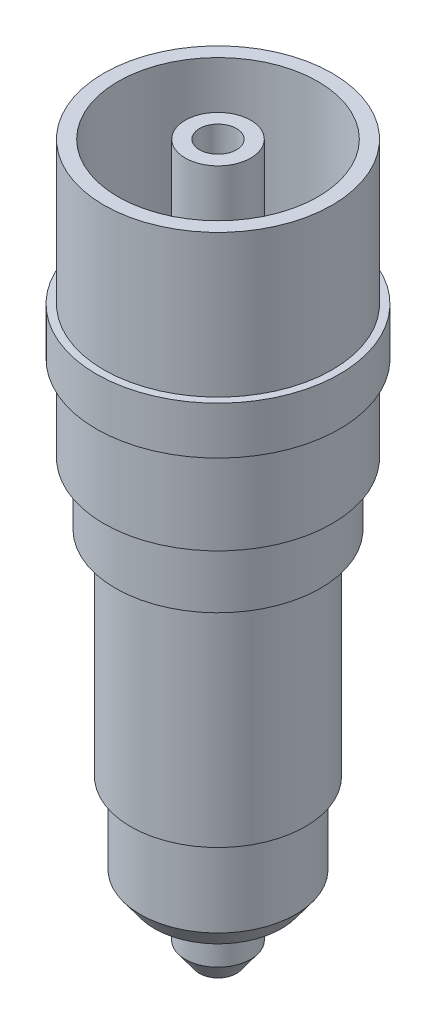
ISO-10303-21;
HEADER;
FILE_DESCRIPTION(('STEP AP214'),'2;1');
FILE_NAME('part.step','',(''),(''),'','','');
FILE_SCHEMA(('AUTOMOTIVE_DESIGN { 1 0 10303 214 1 1 1 1 }'));
ENDSEC;
DATA;
#1=APPLICATION_CONTEXT('core data for automotive mechanical design processes');
#2=APPLICATION_PROTOCOL_DEFINITION('international standard','automotive_design',2000,#1);
#3=PRODUCT_CONTEXT('',#1,'mechanical');
#4=PRODUCT('Part','Part','',(#3));
#5=PRODUCT_RELATED_PRODUCT_CATEGORY('part','',(#4));
#6=PRODUCT_DEFINITION_FORMATION('','',#4);
#7=PRODUCT_DEFINITION_CONTEXT('part definition',#1,'design');
#8=PRODUCT_DEFINITION('design','',#6,#7);
#9=PRODUCT_DEFINITION_SHAPE('','',#8);
#10=(LENGTH_UNIT() NAMED_UNIT(*) SI_UNIT(.MILLI.,.METRE.));
#11=(NAMED_UNIT(*) PLANE_ANGLE_UNIT() SI_UNIT($,.RADIAN.));
#12=(NAMED_UNIT(*) SI_UNIT($,.STERADIAN.) SOLID_ANGLE_UNIT());
#13=UNCERTAINTY_MEASURE_WITH_UNIT(LENGTH_MEASURE(1.E-05),#10,'distance_accuracy_value','');
#14=(GEOMETRIC_REPRESENTATION_CONTEXT(3) GLOBAL_UNCERTAINTY_ASSIGNED_CONTEXT((#13)) GLOBAL_UNIT_ASSIGNED_CONTEXT((#10,
#11,#12)) REPRESENTATION_CONTEXT('',''));
#15=CARTESIAN_POINT('',(0.,0.,0.));
#16=DIRECTION('',(0.,0.,1.));
#17=DIRECTION('',(1.,0.,0.));
#18=AXIS2_PLACEMENT_3D('',#15,#16,#17);
#19=CARTESIAN_POINT('',(-20.131172500129,30.,0.));
#20=DIRECTION('',(0.,1.,0.));
#21=DIRECTION('',(0.,0.,1.));
#22=AXIS2_PLACEMENT_3D('',#19,#20,#21);
#23=PLANE('',#22);
#24=CARTESIAN_POINT('',(3.88640937538214,30.,0.));
#25=DIRECTION('',(0.,1.,0.));
#26=DIRECTION('',(0.,0.,1.));
#27=AXIS2_PLACEMENT_3D('',#24,#25,#26);
#28=CIRCLE('',#27,24.0175818755111);
#29=CARTESIAN_POINT('',(3.88640937538214,30.,24.0175818755111));
#30=VERTEX_POINT('',#29);
#31=EDGE_CURVE('E11',#30,#30,#28,.T.);
#32=ORIENTED_EDGE('',*,*,#31,.T.);
#33=EDGE_LOOP('',(#32));
#34=FACE_BOUND('',#33,.T.);
#35=CARTESIAN_POINT('',(3.88640937538214,30.,0.));
#36=DIRECTION('',(0.,1.,0.));
#37=DIRECTION('',(0.,0.,1.));
#38=AXIS2_PLACEMENT_3D('',#35,#36,#37);
#39=CIRCLE('',#38,21.0175818755111);
#40=CARTESIAN_POINT('',(3.88640937538214,30.,21.0175818755111));
#41=VERTEX_POINT('',#40);
#42=EDGE_CURVE('E123',#41,#41,#39,.T.);
#43=ORIENTED_EDGE('',*,*,#42,.F.);
#44=EDGE_LOOP('',(#43));
#45=FACE_BOUND('',#44,.T.);
#46=ADVANCED_FACE('F47',(#34,#45),#23,.T.);
#47=CARTESIAN_POINT('',(3.88640937538214,30.,0.));
#48=DIRECTION('',(0.,1.,0.));
#49=DIRECTION('',(0.,0.,1.));
#50=AXIS2_PLACEMENT_3D('',#47,#48,#49);
#51=CYLINDRICAL_SURFACE('',#50,24.0175818755111);
#52=CARTESIAN_POINT('',(3.88640937538214,0.,0.));
#53=DIRECTION('',(0.,1.,0.));
#54=DIRECTION('',(0.,0.,1.));
#55=AXIS2_PLACEMENT_3D('',#52,#53,#54);
#56=CIRCLE('',#55,24.0175818755111);
#57=CARTESIAN_POINT('',(3.88640937538214,0.,24.0175818755111));
#58=VERTEX_POINT('',#57);
#59=EDGE_CURVE('E53',#58,#58,#56,.T.);
#60=ORIENTED_EDGE('',*,*,#59,.T.);
#61=EDGE_LOOP('',(#60));
#62=FACE_BOUND('',#61,.T.);
#63=ORIENTED_EDGE('',*,*,#31,.F.);
#64=EDGE_LOOP('',(#63));
#65=FACE_BOUND('',#64,.T.);
#66=ADVANCED_FACE('F131',(#62,#65),#51,.T.);
#67=CARTESIAN_POINT('',(-21.68549339126,0.,0.));
#68=DIRECTION('',(0.,1.,0.));
#69=DIRECTION('',(0.,0.,1.));
#70=AXIS2_PLACEMENT_3D('',#67,#68,#69);
#71=PLANE('',#70);
#72=CARTESIAN_POINT('',(3.88640937538214,0.,0.));
#73=DIRECTION('',(0.,1.,0.));
#74=DIRECTION('',(0.,0.,1.));
#75=AXIS2_PLACEMENT_3D('',#72,#73,#74);
#76=CIRCLE('',#75,25.5719027666422);
#77=CARTESIAN_POINT('',(3.88640937538214,0.,25.5719027666422));
#78=VERTEX_POINT('',#77);
#79=EDGE_CURVE('E57',#78,#78,#76,.T.);
#80=ORIENTED_EDGE('',*,*,#79,.T.);
#81=EDGE_LOOP('',(#80));
#82=FACE_BOUND('',#81,.T.);
#83=ORIENTED_EDGE('',*,*,#59,.F.);
#84=EDGE_LOOP('',(#83));
#85=FACE_BOUND('',#84,.T.);
#86=ADVANCED_FACE('F135',(#82,#85),#71,.T.);
#87=CARTESIAN_POINT('',(3.88640937538214,30.,0.));
#88=DIRECTION('',(0.,1.,0.));
#89=DIRECTION('',(0.,0.,1.));
#90=AXIS2_PLACEMENT_3D('',#87,#88,#89);
#91=CYLINDRICAL_SURFACE('',#90,25.5719027666422);
#92=CARTESIAN_POINT('',(3.88640937538214,-10.,0.));
#93=DIRECTION('',(0.,1.,0.));
#94=DIRECTION('',(0.,0.,1.));
#95=AXIS2_PLACEMENT_3D('',#92,#93,#94);
#96=CIRCLE('',#95,25.5719027666422);
#97=CARTESIAN_POINT('',(3.88640937538214,-10.,25.5719027666422));
#98=VERTEX_POINT('',#97);
#99=EDGE_CURVE('E61',#98,#98,#96,.T.);
#100=ORIENTED_EDGE('',*,*,#99,.T.);
#101=EDGE_LOOP('',(#100));
#102=FACE_BOUND('',#101,.T.);
#103=ORIENTED_EDGE('',*,*,#79,.F.);
#104=EDGE_LOOP('',(#103));
#105=FACE_BOUND('',#104,.T.);
#106=ADVANCED_FACE('F139',(#102,#105),#91,.T.);
#107=CARTESIAN_POINT('',(-21.68549339126,-10.,0.));
#108=DIRECTION('',(0.,-1.,0.));
#109=DIRECTION('',(0.,0.,-1.));
#110=AXIS2_PLACEMENT_3D('',#107,#108,#109);
#111=PLANE('',#110);
#112=CARTESIAN_POINT('',(3.88640937538214,-10.,0.));
#113=DIRECTION('',(0.,1.,0.));
#114=DIRECTION('',(0.,0.,1.));
#115=AXIS2_PLACEMENT_3D('',#112,#113,#114);
#116=CIRCLE('',#115,24.0175818755111);
#117=CARTESIAN_POINT('',(3.88640937538214,-10.,24.0175818755111));
#118=VERTEX_POINT('',#117);
#119=EDGE_CURVE('E66',#118,#118,#116,.T.);
#120=ORIENTED_EDGE('',*,*,#119,.T.);
#121=EDGE_LOOP('',(#120));
#122=FACE_BOUND('',#121,.T.);
#123=ORIENTED_EDGE('',*,*,#99,.F.);
#124=EDGE_LOOP('',(#123));
#125=FACE_BOUND('',#124,.T.);
#126=ADVANCED_FACE('F146',(#122,#125),#111,.T.);
#127=CARTESIAN_POINT('',(3.88640937538214,30.,0.));
#128=DIRECTION('',(0.,1.,0.));
#129=DIRECTION('',(0.,0.,1.));
#130=AXIS2_PLACEMENT_3D('',#127,#128,#129);
#131=CYLINDRICAL_SURFACE('',#130,24.0175818755111);
#132=CARTESIAN_POINT('',(3.88640937538214,-28.,0.));
#133=DIRECTION('',(0.,1.,0.));
#134=DIRECTION('',(0.,0.,1.));
#135=AXIS2_PLACEMENT_3D('',#132,#133,#134);
#136=CIRCLE('',#135,24.0175818755111);
#137=CARTESIAN_POINT('',(3.88640937538214,-28.,24.0175818755111));
#138=VERTEX_POINT('',#137);
#139=EDGE_CURVE('E69',#138,#138,#136,.T.);
#140=ORIENTED_EDGE('',*,*,#139,.T.);
#141=EDGE_LOOP('',(#140));
#142=FACE_BOUND('',#141,.T.);
#143=ORIENTED_EDGE('',*,*,#119,.F.);
#144=EDGE_LOOP('',(#143));
#145=FACE_BOUND('',#144,.T.);
#146=ADVANCED_FACE('F150',(#142,#145),#131,.T.);
#147=CARTESIAN_POINT('',(-20.131172500129,-28.,0.));
#148=DIRECTION('',(0.,-1.,0.));
#149=DIRECTION('',(0.,0.,-1.));
#150=AXIS2_PLACEMENT_3D('',#147,#148,#149);
#151=PLANE('',#150);
#152=CARTESIAN_POINT('',(3.88640937538214,-28.,0.));
#153=DIRECTION('',(0.,1.,0.));
#154=DIRECTION('',(0.,0.,1.));
#155=AXIS2_PLACEMENT_3D('',#152,#153,#154);
#156=CIRCLE('',#155,21.5655393610623);
#157=CARTESIAN_POINT('',(3.88640937538214,-28.,21.5655393610623));
#158=VERTEX_POINT('',#157);
#159=EDGE_CURVE('E72',#158,#158,#156,.T.);
#160=ORIENTED_EDGE('',*,*,#159,.T.);
#161=EDGE_LOOP('',(#160));
#162=FACE_BOUND('',#161,.T.);
#163=ORIENTED_EDGE('',*,*,#139,.F.);
#164=EDGE_LOOP('',(#163));
#165=FACE_BOUND('',#164,.T.);
#166=ADVANCED_FACE('F154',(#162,#165),#151,.T.);
#167=CARTESIAN_POINT('',(3.88640937538214,30.,0.));
#168=DIRECTION('',(0.,1.,0.));
#169=DIRECTION('',(0.,0.,1.));
#170=AXIS2_PLACEMENT_3D('',#167,#168,#169);
#171=CYLINDRICAL_SURFACE('',#170,21.5655393610623);
#172=CARTESIAN_POINT('',(3.88640937538214,-41.,0.));
#173=DIRECTION('',(0.,1.,0.));
#174=DIRECTION('',(0.,0.,1.));
#175=AXIS2_PLACEMENT_3D('',#172,#173,#174);
#176=CIRCLE('',#175,21.5655393610623);
#177=CARTESIAN_POINT('',(3.88640937538214,-41.,21.5655393610623));
#178=VERTEX_POINT('',#177);
#179=EDGE_CURVE('E75',#178,#178,#176,.T.);
#180=ORIENTED_EDGE('',*,*,#179,.T.);
#181=EDGE_LOOP('',(#180));
#182=FACE_BOUND('',#181,.T.);
#183=ORIENTED_EDGE('',*,*,#159,.F.);
#184=EDGE_LOOP('',(#183));
#185=FACE_BOUND('',#184,.T.);
#186=ADVANCED_FACE('F158',(#182,#185),#171,.T.);
#187=CARTESIAN_POINT('',(-17.6791299856802,-41.,0.));
#188=DIRECTION('',(0.,-1.,0.));
#189=DIRECTION('',(0.,0.,-1.));
#190=AXIS2_PLACEMENT_3D('',#187,#188,#189);
#191=PLANE('',#190);
#192=CARTESIAN_POINT('',(3.88640937538214,-41.,0.));
#193=DIRECTION('',(0.,1.,0.));
#194=DIRECTION('',(0.,0.,1.));
#195=AXIS2_PLACEMENT_3D('',#192,#193,#194);
#196=CIRCLE('',#195,18.3741965288098);
#197=CARTESIAN_POINT('',(3.88640937538214,-41.,18.3741965288098));
#198=VERTEX_POINT('',#197);
#199=EDGE_CURVE('E78',#198,#198,#196,.T.);
#200=ORIENTED_EDGE('',*,*,#199,.T.);
#201=EDGE_LOOP('',(#200));
#202=FACE_BOUND('',#201,.T.);
#203=ORIENTED_EDGE('',*,*,#179,.F.);
#204=EDGE_LOOP('',(#203));
#205=FACE_BOUND('',#204,.T.);
#206=ADVANCED_FACE('F162',(#202,#205),#191,.T.);
#207=CARTESIAN_POINT('',(3.88640937538214,30.,0.));
#208=DIRECTION('',(0.,1.,0.));
#209=DIRECTION('',(0.,0.,1.));
#210=AXIS2_PLACEMENT_3D('',#207,#208,#209);
#211=CYLINDRICAL_SURFACE('',#210,18.3741965288098);
#212=CARTESIAN_POINT('',(3.88640937538214,-86.,0.));
#213=DIRECTION('',(0.,1.,0.));
#214=DIRECTION('',(0.,0.,1.));
#215=AXIS2_PLACEMENT_3D('',#212,#213,#214);
#216=CIRCLE('',#215,18.3741965288098);
#217=CARTESIAN_POINT('',(3.88640937538214,-86.,18.3741965288098));
#218=VERTEX_POINT('',#217);
#219=EDGE_CURVE('E81',#218,#218,#216,.T.);
#220=ORIENTED_EDGE('',*,*,#219,.T.);
#221=EDGE_LOOP('',(#220));
#222=FACE_BOUND('',#221,.T.);
#223=ORIENTED_EDGE('',*,*,#199,.F.);
#224=EDGE_LOOP('',(#223));
#225=FACE_BOUND('',#224,.T.);
#226=ADVANCED_FACE('F166',(#222,#225),#211,.T.);
#227=CARTESIAN_POINT('',(-14.4877871534277,-86.,0.));
#228=DIRECTION('',(0.,-1.,0.));
#229=DIRECTION('',(0.,0.,-1.));
#230=AXIS2_PLACEMENT_3D('',#227,#228,#229);
#231=PLANE('',#230);
#232=CARTESIAN_POINT('',(3.88640937538214,-86.,0.));
#233=DIRECTION('',(0.,1.,0.));
#234=DIRECTION('',(0.,0.,1.));
#235=AXIS2_PLACEMENT_3D('',#232,#233,#234);
#236=CIRCLE('',#235,16.3531960706385);
#237=CARTESIAN_POINT('',(3.88640937538214,-86.,16.3531960706385));
#238=VERTEX_POINT('',#237);
#239=EDGE_CURVE('E84',#238,#238,#236,.T.);
#240=ORIENTED_EDGE('',*,*,#239,.T.);
#241=EDGE_LOOP('',(#240));
#242=FACE_BOUND('',#241,.T.);
#243=ORIENTED_EDGE('',*,*,#219,.F.);
#244=EDGE_LOOP('',(#243));
#245=FACE_BOUND('',#244,.T.);
#246=ADVANCED_FACE('F170',(#242,#245),#231,.T.);
#247=CARTESIAN_POINT('',(3.88640937538214,30.,0.));
#248=DIRECTION('',(0.,1.,0.));
#249=DIRECTION('',(0.,0.,1.));
#250=AXIS2_PLACEMENT_3D('',#247,#248,#249);
#251=CYLINDRICAL_SURFACE('',#250,16.3531960706385);
#252=CARTESIAN_POINT('',(3.88640937538214,-103.,0.));
#253=DIRECTION('',(0.,1.,0.));
#254=DIRECTION('',(0.,0.,1.));
#255=AXIS2_PLACEMENT_3D('',#252,#253,#254);
#256=CIRCLE('',#255,16.3531960706385);
#257=CARTESIAN_POINT('',(3.88640937538214,-103.,16.3531960706385));
#258=VERTEX_POINT('',#257);
#259=EDGE_CURVE('E87',#258,#258,#256,.T.);
#260=ORIENTED_EDGE('',*,*,#259,.T.);
#261=EDGE_LOOP('',(#260));
#262=FACE_BOUND('',#261,.T.);
#263=ORIENTED_EDGE('',*,*,#239,.F.);
#264=EDGE_LOOP('',(#263));
#265=FACE_BOUND('',#264,.T.);
#266=ADVANCED_FACE('F174',(#262,#265),#251,.T.);
#267=CARTESIAN_POINT('',(3.88640937538214,-103.,0.));
#268=DIRECTION('',(0.,1.,0.));
#269=DIRECTION('',(0.,0.,1.));
#270=AXIS2_PLACEMENT_3D('',#267,#268,#269);
#271=CONICAL_SURFACE('',#270,16.3531960706385,0.63275342635576);
#272=CARTESIAN_POINT('',(3.88640937538214,-107.090869704172,0.));
#273=DIRECTION('',(0.,1.,0.));
#274=DIRECTION('',(0.,0.,1.));
#275=AXIS2_PLACEMENT_3D('',#272,#273,#274);
#276=CIRCLE('',#275,13.3531960706385);
#277=CARTESIAN_POINT('',(3.88640937538214,-107.090869704172,13.3531960706385));
#278=VERTEX_POINT('',#277);
#279=EDGE_CURVE('E90',#278,#278,#276,.T.);
#280=ORIENTED_EDGE('',*,*,#279,.T.);
#281=EDGE_LOOP('',(#280));
#282=FACE_BOUND('',#281,.T.);
#283=ORIENTED_EDGE('',*,*,#259,.F.);
#284=EDGE_LOOP('',(#283));
#285=FACE_BOUND('',#284,.T.);
#286=ADVANCED_FACE('F178',(#282,#285),#271,.T.);
#287=CARTESIAN_POINT('',(3.88640937538214,30.,0.));
#288=DIRECTION('',(0.,1.,0.));
#289=DIRECTION('',(0.,0.,1.));
#290=AXIS2_PLACEMENT_3D('',#287,#288,#289);
#291=CYLINDRICAL_SURFACE('',#290,13.3531960706385);
#292=CARTESIAN_POINT('',(3.88640937538214,-83.,0.));
#293=DIRECTION('',(0.,1.,0.));
#294=DIRECTION('',(0.,0.,1.));
#295=AXIS2_PLACEMENT_3D('',#292,#293,#294);
#296=CIRCLE('',#295,13.3531960706385);
#297=CARTESIAN_POINT('',(3.88640937538214,-83.,13.3531960706385));
#298=VERTEX_POINT('',#297);
#299=EDGE_CURVE('E93',#298,#298,#296,.T.);
#300=ORIENTED_EDGE('',*,*,#299,.T.);
#301=EDGE_LOOP('',(#300));
#302=FACE_BOUND('',#301,.T.);
#303=ORIENTED_EDGE('',*,*,#279,.F.);
#304=EDGE_LOOP('',(#303));
#305=FACE_BOUND('',#304,.T.);
#306=ADVANCED_FACE('F182',(#302,#305),#291,.F.);
#307=CARTESIAN_POINT('',(-11.4877871534277,-83.,0.));
#308=DIRECTION('',(0.,1.,0.));
#309=DIRECTION('',(0.,0.,1.));
#310=AXIS2_PLACEMENT_3D('',#307,#308,#309);
#311=PLANE('',#310);
#312=CARTESIAN_POINT('',(3.88640937538214,-83.,0.));
#313=DIRECTION('',(0.,1.,0.));
#314=DIRECTION('',(0.,0.,1.));
#315=AXIS2_PLACEMENT_3D('',#312,#313,#314);
#316=CIRCLE('',#315,15.3741965288098);
#317=CARTESIAN_POINT('',(3.88640937538214,-83.,15.3741965288098));
#318=VERTEX_POINT('',#317);
#319=EDGE_CURVE('E96',#318,#318,#316,.T.);
#320=ORIENTED_EDGE('',*,*,#319,.T.);
#321=EDGE_LOOP('',(#320));
#322=FACE_BOUND('',#321,.T.);
#323=ORIENTED_EDGE('',*,*,#299,.F.);
#324=EDGE_LOOP('',(#323));
#325=FACE_BOUND('',#324,.T.);
#326=ADVANCED_FACE('F186',(#322,#325),#311,.T.);
#327=CARTESIAN_POINT('',(3.88640937538214,30.,0.));
#328=DIRECTION('',(0.,1.,0.));
#329=DIRECTION('',(0.,0.,1.));
#330=AXIS2_PLACEMENT_3D('',#327,#328,#329);
#331=CYLINDRICAL_SURFACE('',#330,15.3741965288098);
#332=CARTESIAN_POINT('',(3.88640937538214,-38.,0.));
#333=DIRECTION('',(0.,1.,0.));
#334=DIRECTION('',(0.,0.,1.));
#335=AXIS2_PLACEMENT_3D('',#332,#333,#334);
#336=CIRCLE('',#335,15.3741965288098);
#337=CARTESIAN_POINT('',(3.88640937538214,-38.,15.3741965288098));
#338=VERTEX_POINT('',#337);
#339=EDGE_CURVE('E99',#338,#338,#336,.T.);
#340=ORIENTED_EDGE('',*,*,#339,.T.);
#341=EDGE_LOOP('',(#340));
#342=FACE_BOUND('',#341,.T.);
#343=ORIENTED_EDGE('',*,*,#319,.F.);
#344=EDGE_LOOP('',(#343));
#345=FACE_BOUND('',#344,.T.);
#346=ADVANCED_FACE('F190',(#342,#345),#331,.F.);
#347=CARTESIAN_POINT('',(-14.6791299856802,-38.,0.));
#348=DIRECTION('',(0.,1.,0.));
#349=DIRECTION('',(0.,0.,1.));
#350=AXIS2_PLACEMENT_3D('',#347,#348,#349);
#351=PLANE('',#350);
#352=CARTESIAN_POINT('',(3.88640937538214,-38.,0.));
#353=DIRECTION('',(0.,1.,0.));
#354=DIRECTION('',(0.,0.,1.));
#355=AXIS2_PLACEMENT_3D('',#352,#353,#354);
#356=CIRCLE('',#355,18.5655393610623);
#357=CARTESIAN_POINT('',(3.88640937538214,-38.,18.5655393610623));
#358=VERTEX_POINT('',#357);
#359=EDGE_CURVE('E102',#358,#358,#356,.T.);
#360=ORIENTED_EDGE('',*,*,#359,.T.);
#361=EDGE_LOOP('',(#360));
#362=FACE_BOUND('',#361,.T.);
#363=ORIENTED_EDGE('',*,*,#339,.F.);
#364=EDGE_LOOP('',(#363));
#365=FACE_BOUND('',#364,.T.);
#366=ADVANCED_FACE('F194',(#362,#365),#351,.T.);
#367=CARTESIAN_POINT('',(3.88640937538214,30.,0.));
#368=DIRECTION('',(0.,1.,0.));
#369=DIRECTION('',(0.,0.,1.));
#370=AXIS2_PLACEMENT_3D('',#367,#368,#369);
#371=CYLINDRICAL_SURFACE('',#370,18.5655393610623);
#372=CARTESIAN_POINT('',(3.88640937538214,-25.,0.));
#373=DIRECTION('',(0.,1.,0.));
#374=DIRECTION('',(0.,0.,1.));
#375=AXIS2_PLACEMENT_3D('',#372,#373,#374);
#376=CIRCLE('',#375,18.5655393610623);
#377=CARTESIAN_POINT('',(3.88640937538214,-25.,18.5655393610623));
#378=VERTEX_POINT('',#377);
#379=EDGE_CURVE('E105',#378,#378,#376,.T.);
#380=ORIENTED_EDGE('',*,*,#379,.T.);
#381=EDGE_LOOP('',(#380));
#382=FACE_BOUND('',#381,.T.);
#383=ORIENTED_EDGE('',*,*,#359,.F.);
#384=EDGE_LOOP('',(#383));
#385=FACE_BOUND('',#384,.T.);
#386=ADVANCED_FACE('F198',(#382,#385),#371,.F.);
#387=CARTESIAN_POINT('',(-17.131172500129,-25.,0.));
#388=DIRECTION('',(0.,1.,0.));
#389=DIRECTION('',(0.,0.,1.));
#390=AXIS2_PLACEMENT_3D('',#387,#388,#389);
#391=PLANE('',#390);
#392=CARTESIAN_POINT('',(3.88640937538214,-25.,0.));
#393=DIRECTION('',(0.,1.,0.));
#394=DIRECTION('',(0.,0.,1.));
#395=AXIS2_PLACEMENT_3D('',#392,#393,#394);
#396=CIRCLE('',#395,21.0175818755111);
#397=CARTESIAN_POINT('',(3.88640937538214,-25.,21.0175818755111));
#398=VERTEX_POINT('',#397);
#399=EDGE_CURVE('E108',#398,#398,#396,.T.);
#400=ORIENTED_EDGE('',*,*,#399,.T.);
#401=EDGE_LOOP('',(#400));
#402=FACE_BOUND('',#401,.T.);
#403=ORIENTED_EDGE('',*,*,#379,.F.);
#404=EDGE_LOOP('',(#403));
#405=FACE_BOUND('',#404,.T.);
#406=ADVANCED_FACE('F202',(#402,#405),#391,.T.);
#407=CARTESIAN_POINT('',(3.88640937538214,30.,0.));
#408=DIRECTION('',(0.,1.,0.));
#409=DIRECTION('',(0.,0.,1.));
#410=AXIS2_PLACEMENT_3D('',#407,#408,#409);
#411=CYLINDRICAL_SURFACE('',#410,21.0175818755111);
#412=CARTESIAN_POINT('',(3.88640937538214,-7.,0.));
#413=DIRECTION('',(0.,1.,0.));
#414=DIRECTION('',(0.,0.,1.));
#415=AXIS2_PLACEMENT_3D('',#412,#413,#414);
#416=CIRCLE('',#415,21.0175818755111);
#417=CARTESIAN_POINT('',(3.88640937538214,-7.,21.0175818755111));
#418=VERTEX_POINT('',#417);
#419=EDGE_CURVE('E111',#418,#418,#416,.T.);
#420=ORIENTED_EDGE('',*,*,#419,.T.);
#421=EDGE_LOOP('',(#420));
#422=FACE_BOUND('',#421,.T.);
#423=ORIENTED_EDGE('',*,*,#399,.F.);
#424=EDGE_LOOP('',(#423));
#425=FACE_BOUND('',#424,.T.);
#426=ADVANCED_FACE('F206',(#422,#425),#411,.F.);
#427=CARTESIAN_POINT('',(-18.68549339126,-7.,0.));
#428=DIRECTION('',(0.,1.,0.));
#429=DIRECTION('',(0.,0.,1.));
#430=AXIS2_PLACEMENT_3D('',#427,#428,#429);
#431=PLANE('',#430);
#432=CARTESIAN_POINT('',(3.88640937538214,-7.,0.));
#433=DIRECTION('',(0.,1.,0.));
#434=DIRECTION('',(0.,0.,1.));
#435=AXIS2_PLACEMENT_3D('',#432,#433,#434);
#436=CIRCLE('',#435,22.5719027666422);
#437=CARTESIAN_POINT('',(3.88640937538214,-7.,22.5719027666422));
#438=VERTEX_POINT('',#437);
#439=EDGE_CURVE('E114',#438,#438,#436,.T.);
#440=ORIENTED_EDGE('',*,*,#439,.T.);
#441=EDGE_LOOP('',(#440));
#442=FACE_BOUND('',#441,.T.);
#443=ORIENTED_EDGE('',*,*,#419,.F.);
#444=EDGE_LOOP('',(#443));
#445=FACE_BOUND('',#444,.T.);
#446=ADVANCED_FACE('F210',(#442,#445),#431,.T.);
#447=CARTESIAN_POINT('',(3.88640937538214,30.,0.));
#448=DIRECTION('',(0.,1.,0.));
#449=DIRECTION('',(0.,0.,1.));
#450=AXIS2_PLACEMENT_3D('',#447,#448,#449);
#451=CYLINDRICAL_SURFACE('',#450,22.5719027666422);
#452=CARTESIAN_POINT('',(3.88640937538214,-3.,0.));
#453=DIRECTION('',(0.,1.,0.));
#454=DIRECTION('',(0.,0.,1.));
#455=AXIS2_PLACEMENT_3D('',#452,#453,#454);
#456=CIRCLE('',#455,22.5719027666422);
#457=CARTESIAN_POINT('',(3.88640937538214,-3.,22.5719027666422));
#458=VERTEX_POINT('',#457);
#459=EDGE_CURVE('E117',#458,#458,#456,.T.);
#460=ORIENTED_EDGE('',*,*,#459,.T.);
#461=EDGE_LOOP('',(#460));
#462=FACE_BOUND('',#461,.T.);
#463=ORIENTED_EDGE('',*,*,#439,.F.);
#464=EDGE_LOOP('',(#463));
#465=FACE_BOUND('',#464,.T.);
#466=ADVANCED_FACE('F214',(#462,#465),#451,.F.);
#467=CARTESIAN_POINT('',(-18.68549339126,-3.,0.));
#468=DIRECTION('',(0.,-1.,0.));
#469=DIRECTION('',(0.,0.,-1.));
#470=AXIS2_PLACEMENT_3D('',#467,#468,#469);
#471=PLANE('',#470);
#472=CARTESIAN_POINT('',(3.88640937538214,-3.,0.));
#473=DIRECTION('',(0.,1.,0.));
#474=DIRECTION('',(0.,0.,1.));
#475=AXIS2_PLACEMENT_3D('',#472,#473,#474);
#476=CIRCLE('',#475,21.0175818755111);
#477=CARTESIAN_POINT('',(3.88640937538214,-3.,21.0175818755111));
#478=VERTEX_POINT('',#477);
#479=EDGE_CURVE('E120',#478,#478,#476,.T.);
#480=ORIENTED_EDGE('',*,*,#479,.T.);
#481=EDGE_LOOP('',(#480));
#482=FACE_BOUND('',#481,.T.);
#483=ORIENTED_EDGE('',*,*,#459,.F.);
#484=EDGE_LOOP('',(#483));
#485=FACE_BOUND('',#484,.T.);
#486=ADVANCED_FACE('F218',(#482,#485),#471,.T.);
#487=CARTESIAN_POINT('',(3.88640937538214,30.,0.));
#488=DIRECTION('',(0.,1.,0.));
#489=DIRECTION('',(0.,0.,1.));
#490=AXIS2_PLACEMENT_3D('',#487,#488,#489);
#491=CYLINDRICAL_SURFACE('',#490,21.0175818755111);
#492=ORIENTED_EDGE('',*,*,#42,.T.);
#493=EDGE_LOOP('',(#492));
#494=FACE_BOUND('',#493,.T.);
#495=ORIENTED_EDGE('',*,*,#479,.F.);
#496=EDGE_LOOP('',(#495));
#497=FACE_BOUND('',#496,.T.);
#498=ADVANCED_FACE('F127',(#494,#497),#491,.F.);
#499=CLOSED_SHELL('',(#46,#66,#86,#106,#126,#146,#166,#186,#206,#226,#246,#266,#286,#306,#326,
#346,#366,#386,#406,#426,#446,#466,#486,#498));
#500=MANIFOLD_SOLID_BREP('B2',#499);
#501=CARTESIAN_POINT('',(-3.,30.,0.));
#502=DIRECTION('',(0.,1.,0.));
#503=DIRECTION('',(0.,0.,1.));
#504=AXIS2_PLACEMENT_3D('',#501,#502,#503);
#505=PLANE('',#504);
#506=CARTESIAN_POINT('',(3.88640937538214,30.,0.));
#507=DIRECTION('',(0.,1.,0.));
#508=DIRECTION('',(0.,0.,1.));
#509=AXIS2_PLACEMENT_3D('',#506,#507,#508);
#510=CIRCLE('',#509,6.88640937538214);
#511=CARTESIAN_POINT('',(3.88640937538214,30.,6.88640937538214));
#512=VERTEX_POINT('',#511);
#513=EDGE_CURVE('E429',#512,#512,#510,.T.);
#514=ORIENTED_EDGE('',*,*,#513,.T.);
#515=EDGE_LOOP('',(#514));
#516=FACE_BOUND('',#515,.T.);
#517=CARTESIAN_POINT('',(3.88640937538214,30.,0.));
#518=DIRECTION('',(0.,1.,0.));
#519=DIRECTION('',(0.,0.,1.));
#520=AXIS2_PLACEMENT_3D('',#517,#518,#519);
#521=CIRCLE('',#520,3.88640937538214);
#522=CARTESIAN_POINT('',(3.88640937538214,30.,3.88640937538214));
#523=VERTEX_POINT('',#522);
#524=EDGE_CURVE('E46',#523,#523,#521,.T.);
#525=ORIENTED_EDGE('',*,*,#524,.F.);
#526=EDGE_LOOP('',(#525));
#527=FACE_BOUND('',#526,.T.);
#528=ADVANCED_FACE('F415',(#516,#527),#505,.T.);
#529=CARTESIAN_POINT('',(3.88640937538214,30.,0.));
#530=DIRECTION('',(0.,1.,0.));
#531=DIRECTION('',(0.,0.,1.));
#532=AXIS2_PLACEMENT_3D('',#529,#530,#531);
#533=CYLINDRICAL_SURFACE('',#532,3.88640937538213);
#534=ORIENTED_EDGE('',*,*,#524,.T.);
#535=EDGE_LOOP('',(#534));
#536=FACE_BOUND('',#535,.T.);
#537=CARTESIAN_POINT('',(3.88640937538214,-120.,0.));
#538=DIRECTION('',(0.,1.,0.));
#539=DIRECTION('',(0.,0.,1.));
#540=AXIS2_PLACEMENT_3D('',#537,#538,#539);
#541=CIRCLE('',#540,3.88640937538212);
#542=CARTESIAN_POINT('',(3.88640937538214,-120.,3.88640937538212));
#543=VERTEX_POINT('',#542);
#544=EDGE_CURVE('E421',#543,#543,#541,.T.);
#545=ORIENTED_EDGE('',*,*,#544,.F.);
#546=EDGE_LOOP('',(#545));
#547=FACE_BOUND('',#546,.T.);
#548=ADVANCED_FACE('F445',(#536,#547),#533,.F.);
#549=CARTESIAN_POINT('',(3.88640937538214,-115.909130295828,0.));
#550=DIRECTION('',(0.,1.,0.));
#551=DIRECTION('',(0.,0.,1.));
#552=AXIS2_PLACEMENT_3D('',#549,#550,#551);
#553=CONICAL_SURFACE('',#552,6.88640937538213,0.632753426355763);
#554=ORIENTED_EDGE('',*,*,#544,.T.);
#555=EDGE_LOOP('',(#554));
#556=FACE_BOUND('',#555,.T.);
#557=CARTESIAN_POINT('',(3.88640937538214,-115.909130295828,0.));
#558=DIRECTION('',(0.,1.,0.));
#559=DIRECTION('',(0.,0.,1.));
#560=AXIS2_PLACEMENT_3D('',#557,#558,#559);
#561=CIRCLE('',#560,6.88640937538213);
#562=CARTESIAN_POINT('',(3.88640937538214,-115.909130295828,6.88640937538213));
#563=VERTEX_POINT('',#562);
#564=EDGE_CURVE('E425',#563,#563,#561,.T.);
#565=ORIENTED_EDGE('',*,*,#564,.F.);
#566=EDGE_LOOP('',(#565));
#567=FACE_BOUND('',#566,.T.);
#568=ADVANCED_FACE('F439',(#556,#567),#553,.T.);
#569=CARTESIAN_POINT('',(3.88640937538214,30.,0.));
#570=DIRECTION('',(0.,1.,0.));
#571=DIRECTION('',(0.,0.,1.));
#572=AXIS2_PLACEMENT_3D('',#569,#570,#571);
#573=CYLINDRICAL_SURFACE('',#572,6.88640937538214);
#574=ORIENTED_EDGE('',*,*,#564,.T.);
#575=EDGE_LOOP('',(#574));
#576=FACE_BOUND('',#575,.T.);
#577=ORIENTED_EDGE('',*,*,#513,.F.);
#578=EDGE_LOOP('',(#577));
#579=FACE_BOUND('',#578,.T.);
#580=ADVANCED_FACE('F437',(#576,#579),#573,.T.);
#581=CLOSED_SHELL('',(#528,#548,#568,#580));
#582=MANIFOLD_SOLID_BREP('B6',#581);
#583=ADVANCED_BREP_SHAPE_REPRESENTATION('',(#18,#500,#582),#14);
#584=SHAPE_DEFINITION_REPRESENTATION(#9,#583);
ENDSEC;
END-ISO-10303-21;
